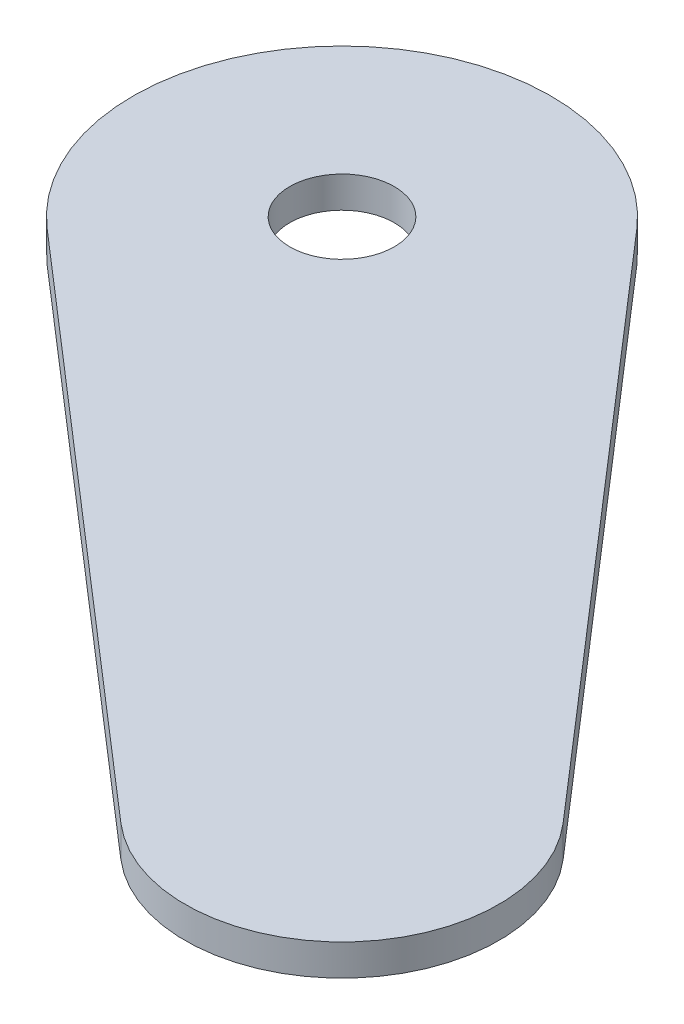
ISO-10303-21;
HEADER;
FILE_DESCRIPTION(('STEP AP214'),'2;1');
FILE_NAME('part.step','',(''),(''),'','','');
FILE_SCHEMA(('AUTOMOTIVE_DESIGN { 1 0 10303 214 1 1 1 1 }'));
ENDSEC;
DATA;
#1=APPLICATION_CONTEXT('core data for automotive mechanical design processes');
#2=APPLICATION_PROTOCOL_DEFINITION('international standard','automotive_design',2000,#1);
#3=PRODUCT_CONTEXT('',#1,'mechanical');
#4=PRODUCT('Part','Part','',(#3));
#5=PRODUCT_RELATED_PRODUCT_CATEGORY('part','',(#4));
#6=PRODUCT_DEFINITION_FORMATION('','',#4);
#7=PRODUCT_DEFINITION_CONTEXT('part definition',#1,'design');
#8=PRODUCT_DEFINITION('design','',#6,#7);
#9=PRODUCT_DEFINITION_SHAPE('','',#8);
#10=(LENGTH_UNIT() NAMED_UNIT(*) SI_UNIT(.MILLI.,.METRE.));
#11=(NAMED_UNIT(*) PLANE_ANGLE_UNIT() SI_UNIT($,.RADIAN.));
#12=(NAMED_UNIT(*) SI_UNIT($,.STERADIAN.) SOLID_ANGLE_UNIT());
#13=UNCERTAINTY_MEASURE_WITH_UNIT(LENGTH_MEASURE(1.E-05),#10,'distance_accuracy_value','');
#14=(GEOMETRIC_REPRESENTATION_CONTEXT(3) GLOBAL_UNCERTAINTY_ASSIGNED_CONTEXT((#13)) GLOBAL_UNIT_ASSIGNED_CONTEXT((#10,
#11,#12)) REPRESENTATION_CONTEXT('',''));
#15=CARTESIAN_POINT('',(0.,0.,0.));
#16=DIRECTION('',(0.,0.,1.));
#17=DIRECTION('',(1.,0.,0.));
#18=AXIS2_PLACEMENT_3D('',#15,#16,#17);
#19=CARTESIAN_POINT('',(0.,3.,0.));
#20=DIRECTION('',(0.,-1.,0.));
#21=DIRECTION('',(0.,0.,-1.));
#22=AXIS2_PLACEMENT_3D('',#19,#20,#21);
#23=CYLINDRICAL_SURFACE('',#22,20.);
#24=CARTESIAN_POINT('',(0.,0.,0.));
#25=DIRECTION('',(0.,1.,0.));
#26=DIRECTION('',(0.,0.,1.));
#27=AXIS2_PLACEMENT_3D('',#24,#25,#26);
#28=CIRCLE('',#27,20.);
#29=CARTESIAN_POINT('',(15.1161651575033,0.,-13.0958600683989));
#30=VERTEX_POINT('',#29);
#31=CARTESIAN_POINT('',(-13.0958600683989,0.,15.1161651575033));
#32=VERTEX_POINT('',#31);
#33=EDGE_CURVE('E116',#30,#32,#28,.T.);
#34=ORIENTED_EDGE('',*,*,#33,.T.);
#35=DIRECTION('',(0.,-1.,0.));
#36=VECTOR('',#35,1.);
#37=CARTESIAN_POINT('',(-13.0958600683989,3.,15.1161651575033));
#38=LINE('',#37,#36);
#39=CARTESIAN_POINT('',(-13.0958600683989,3.,15.1161651575033));
#40=VERTEX_POINT('',#39);
#41=EDGE_CURVE('E11',#40,#32,#38,.T.);
#42=ORIENTED_EDGE('',*,*,#41,.F.);
#43=CARTESIAN_POINT('',(0.,3.,0.));
#44=DIRECTION('',(0.,1.,0.));
#45=DIRECTION('',(0.,0.,1.));
#46=AXIS2_PLACEMENT_3D('',#43,#44,#45);
#47=CIRCLE('',#46,20.);
#48=CARTESIAN_POINT('',(15.1161651575033,3.,-13.0958600683989));
#49=VERTEX_POINT('',#48);
#50=EDGE_CURVE('E97',#49,#40,#47,.T.);
#51=ORIENTED_EDGE('',*,*,#50,.F.);
#52=DIRECTION('',(0.,-1.,0.));
#53=VECTOR('',#52,1.);
#54=CARTESIAN_POINT('',(15.1161651575033,3.,-13.0958600683989));
#55=LINE('',#54,#53);
#56=EDGE_CURVE('E64',#49,#30,#55,.T.);
#57=ORIENTED_EDGE('',*,*,#56,.T.);
#58=EDGE_LOOP('',(#34,#42,#51,#57));
#59=FACE_BOUND('',#58,.T.);
#60=ADVANCED_FACE('F46',(#59),#23,.T.);
#61=CARTESIAN_POINT('',(-13.0958600683989,3.,15.1161651575033));
#62=DIRECTION('',(0.654793003419943,0.,-0.755808257875164));
#63=DIRECTION('',(-0.755808257875164,0.,-0.654793003419943));
#64=AXIS2_PLACEMENT_3D('',#61,#62,#63);
#65=PLANE('',#64);
#66=DIRECTION('',(0.755808257875164,0.,0.654793003419943));
#67=VECTOR('',#66,1.);
#68=CARTESIAN_POINT('',(-13.0958600683989,0.,15.1161651575033));
#69=LINE('',#68,#67);
#70=CARTESIAN_POINT('',(39.6755796317592,0.,60.8345985511858));
#71=VERTEX_POINT('',#70);
#72=EDGE_CURVE('E103',#32,#71,#69,.T.);
#73=ORIENTED_EDGE('',*,*,#72,.T.);
#74=DIRECTION('',(0.,-1.,0.));
#75=VECTOR('',#74,1.);
#76=CARTESIAN_POINT('',(39.6755796317592,3.,60.8345985511858));
#77=LINE('',#76,#75);
#78=CARTESIAN_POINT('',(39.6755796317592,3.,60.8345985511858));
#79=VERTEX_POINT('',#78);
#80=EDGE_CURVE('E56',#79,#71,#77,.T.);
#81=ORIENTED_EDGE('',*,*,#80,.F.);
#82=DIRECTION('',(0.755808257875164,0.,0.654793003419943));
#83=VECTOR('',#82,1.);
#84=CARTESIAN_POINT('',(-13.0958600683989,3.,15.1161651575033));
#85=LINE('',#84,#83);
#86=EDGE_CURVE('E90',#40,#79,#85,.T.);
#87=ORIENTED_EDGE('',*,*,#86,.F.);
#88=ORIENTED_EDGE('',*,*,#41,.T.);
#89=EDGE_LOOP('',(#73,#81,#87,#88));
#90=FACE_BOUND('',#89,.T.);
#91=ADVANCED_FACE('F102',(#90),#65,.F.);
#92=CARTESIAN_POINT('',(49.4974746830583,3.,49.4974746830583));
#93=DIRECTION('',(0.,-1.,0.));
#94=DIRECTION('',(0.,0.,-1.));
#95=AXIS2_PLACEMENT_3D('',#92,#93,#94);
#96=CYLINDRICAL_SURFACE('',#95,15.);
#97=CARTESIAN_POINT('',(49.4974746830583,0.,49.4974746830583));
#98=DIRECTION('',(0.,1.,0.));
#99=DIRECTION('',(0.,0.,1.));
#100=AXIS2_PLACEMENT_3D('',#97,#98,#99);
#101=CIRCLE('',#100,15.);
#102=CARTESIAN_POINT('',(60.8345985511858,0.,39.6755796317592));
#103=VERTEX_POINT('',#102);
#104=EDGE_CURVE('E121',#71,#103,#101,.T.);
#105=ORIENTED_EDGE('',*,*,#104,.T.);
#106=DIRECTION('',(0.,-1.,0.));
#107=VECTOR('',#106,1.);
#108=CARTESIAN_POINT('',(60.8345985511858,3.,39.6755796317592));
#109=LINE('',#108,#107);
#110=CARTESIAN_POINT('',(60.8345985511858,3.,39.6755796317592));
#111=VERTEX_POINT('',#110);
#112=EDGE_CURVE('E79',#111,#103,#109,.T.);
#113=ORIENTED_EDGE('',*,*,#112,.F.);
#114=CARTESIAN_POINT('',(49.4974746830583,3.,49.4974746830583));
#115=DIRECTION('',(0.,1.,0.));
#116=DIRECTION('',(0.,0.,1.));
#117=AXIS2_PLACEMENT_3D('',#114,#115,#116);
#118=CIRCLE('',#117,15.);
#119=EDGE_CURVE('E96',#79,#111,#118,.T.);
#120=ORIENTED_EDGE('',*,*,#119,.F.);
#121=ORIENTED_EDGE('',*,*,#80,.T.);
#122=EDGE_LOOP('',(#105,#113,#120,#121));
#123=FACE_BOUND('',#122,.T.);
#124=ADVANCED_FACE('F108',(#123),#96,.T.);
#125=CARTESIAN_POINT('',(15.1161651575033,3.,-13.0958600683989));
#126=DIRECTION('',(0.755808257875164,0.,-0.654793003419943));
#127=DIRECTION('',(-0.654793003419943,0.,-0.755808257875164));
#128=AXIS2_PLACEMENT_3D('',#125,#126,#127);
#129=PLANE('',#128);
#130=DIRECTION('',(0.654793003419943,0.,0.755808257875164));
#131=VECTOR('',#130,1.);
#132=CARTESIAN_POINT('',(15.1161651575033,0.,-13.0958600683989));
#133=LINE('',#132,#131);
#134=EDGE_CURVE('E124',#30,#103,#133,.T.);
#135=ORIENTED_EDGE('',*,*,#134,.F.);
#136=ORIENTED_EDGE('',*,*,#56,.F.);
#137=DIRECTION('',(0.654793003419943,0.,0.755808257875164));
#138=VECTOR('',#137,1.);
#139=CARTESIAN_POINT('',(15.1161651575033,3.,-13.0958600683989));
#140=LINE('',#139,#138);
#141=EDGE_CURVE('E110',#49,#111,#140,.T.);
#142=ORIENTED_EDGE('',*,*,#141,.T.);
#143=ORIENTED_EDGE('',*,*,#112,.T.);
#144=EDGE_LOOP('',(#135,#136,#142,#143));
#145=FACE_BOUND('',#144,.T.);
#146=ADVANCED_FACE('F157',(#145),#129,.T.);
#147=CARTESIAN_POINT('',(0.,3.,0.));
#148=DIRECTION('',(0.,1.,0.));
#149=DIRECTION('',(0.,0.,1.));
#150=AXIS2_PLACEMENT_3D('',#147,#148,#149);
#151=PLANE('',#150);
#152=CARTESIAN_POINT('',(0.,3.,0.));
#153=DIRECTION('',(0.,1.,0.));
#154=DIRECTION('',(0.,0.,1.));
#155=AXIS2_PLACEMENT_3D('',#152,#153,#154);
#156=CIRCLE('',#155,5.);
#157=CARTESIAN_POINT('',(0.,3.,5.));
#158=VERTEX_POINT('',#157);
#159=EDGE_CURVE('E134',#158,#158,#156,.T.);
#160=ORIENTED_EDGE('',*,*,#159,.F.);
#161=EDGE_LOOP('',(#160));
#162=FACE_BOUND('',#161,.T.);
#163=ORIENTED_EDGE('',*,*,#50,.T.);
#164=ORIENTED_EDGE('',*,*,#86,.T.);
#165=ORIENTED_EDGE('',*,*,#119,.T.);
#166=ORIENTED_EDGE('',*,*,#141,.F.);
#167=EDGE_LOOP('',(#163,#164,#165,#166));
#168=FACE_BOUND('',#167,.T.);
#169=ADVANCED_FACE('F93',(#162,#168),#151,.T.);
#170=CARTESIAN_POINT('',(0.,0.,0.));
#171=DIRECTION('',(0.,1.,0.));
#172=DIRECTION('',(0.,0.,1.));
#173=AXIS2_PLACEMENT_3D('',#170,#171,#172);
#174=PLANE('',#173);
#175=CARTESIAN_POINT('',(0.,0.,0.));
#176=DIRECTION('',(0.,1.,0.));
#177=DIRECTION('',(0.,0.,1.));
#178=AXIS2_PLACEMENT_3D('',#175,#176,#177);
#179=CIRCLE('',#178,5.);
#180=CARTESIAN_POINT('',(0.,0.,5.));
#181=VERTEX_POINT('',#180);
#182=EDGE_CURVE('E49',#181,#181,#179,.T.);
#183=ORIENTED_EDGE('',*,*,#182,.T.);
#184=EDGE_LOOP('',(#183));
#185=FACE_BOUND('',#184,.T.);
#186=ORIENTED_EDGE('',*,*,#33,.F.);
#187=ORIENTED_EDGE('',*,*,#134,.T.);
#188=ORIENTED_EDGE('',*,*,#104,.F.);
#189=ORIENTED_EDGE('',*,*,#72,.F.);
#190=EDGE_LOOP('',(#186,#187,#188,#189));
#191=FACE_BOUND('',#190,.T.);
#192=ADVANCED_FACE('F143',(#185,#191),#174,.F.);
#193=CARTESIAN_POINT('',(0.,-7.,0.));
#194=DIRECTION('',(0.,1.,0.));
#195=DIRECTION('',(0.,0.,1.));
#196=AXIS2_PLACEMENT_3D('',#193,#194,#195);
#197=CYLINDRICAL_SURFACE('',#196,5.);
#198=ORIENTED_EDGE('',*,*,#159,.T.);
#199=EDGE_LOOP('',(#198));
#200=FACE_BOUND('',#199,.T.);
#201=ORIENTED_EDGE('',*,*,#182,.F.);
#202=EDGE_LOOP('',(#201));
#203=FACE_BOUND('',#202,.T.);
#204=ADVANCED_FACE('F145',(#200,#203),#197,.F.);
#205=CLOSED_SHELL('',(#60,#91,#124,#146,#169,#192,#204));
#206=MANIFOLD_SOLID_BREP('B2',#205);
#207=ADVANCED_BREP_SHAPE_REPRESENTATION('',(#18,#206),#14);
#208=SHAPE_DEFINITION_REPRESENTATION(#9,#207);
ENDSEC;
END-ISO-10303-21;
